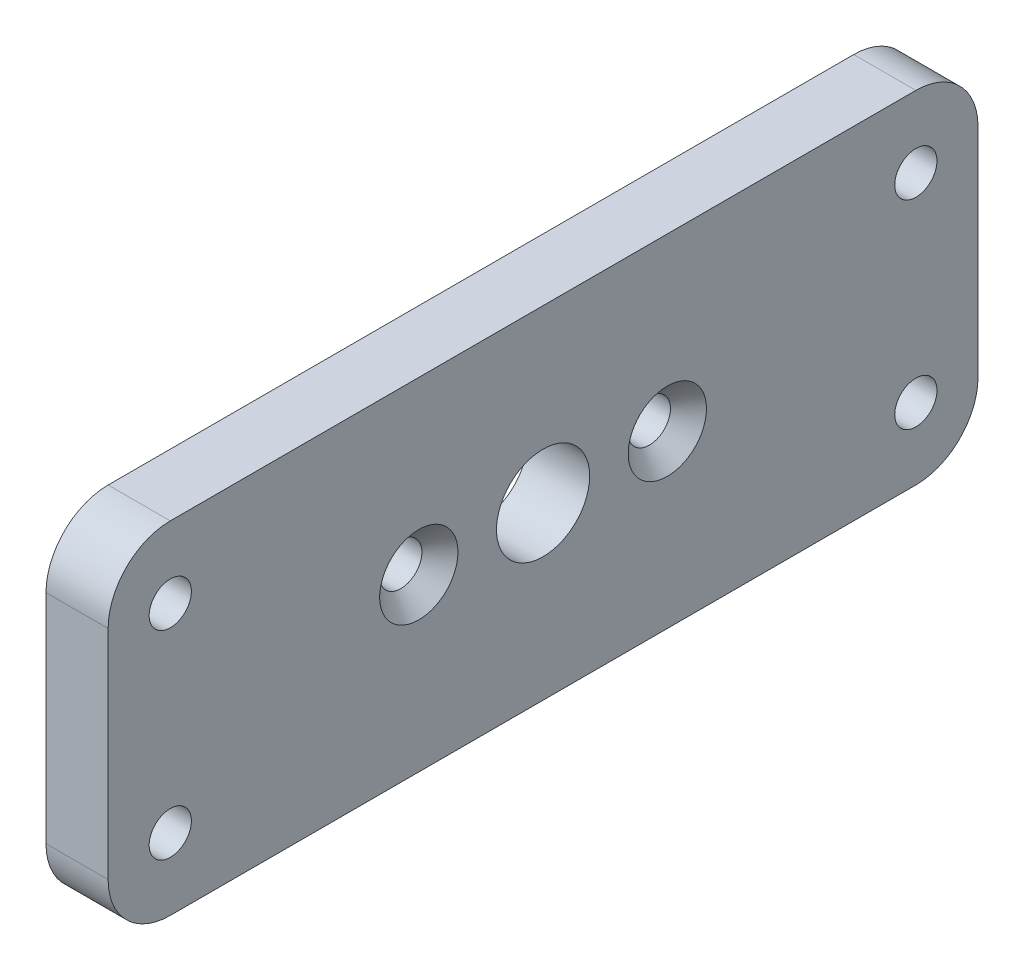
ISO-10303-21;
HEADER;
FILE_DESCRIPTION(('STEP AP214'),'2;1');
FILE_NAME('part.step','',(''),(''),'','','');
FILE_SCHEMA(('AUTOMOTIVE_DESIGN { 1 0 10303 214 1 1 1 1 }'));
ENDSEC;
DATA;
#1=APPLICATION_CONTEXT('core data for automotive mechanical design processes');
#2=APPLICATION_PROTOCOL_DEFINITION('international standard','automotive_design',2000,#1);
#3=PRODUCT_CONTEXT('',#1,'mechanical');
#4=PRODUCT('Part','Part','',(#3));
#5=PRODUCT_RELATED_PRODUCT_CATEGORY('part','',(#4));
#6=PRODUCT_DEFINITION_FORMATION('','',#4);
#7=PRODUCT_DEFINITION_CONTEXT('part definition',#1,'design');
#8=PRODUCT_DEFINITION('design','',#6,#7);
#9=PRODUCT_DEFINITION_SHAPE('','',#8);
#10=(LENGTH_UNIT() NAMED_UNIT(*) SI_UNIT(.MILLI.,.METRE.));
#11=(NAMED_UNIT(*) PLANE_ANGLE_UNIT() SI_UNIT($,.RADIAN.));
#12=(NAMED_UNIT(*) SI_UNIT($,.STERADIAN.) SOLID_ANGLE_UNIT());
#13=UNCERTAINTY_MEASURE_WITH_UNIT(LENGTH_MEASURE(1.E-05),#10,'distance_accuracy_value','');
#14=(GEOMETRIC_REPRESENTATION_CONTEXT(3) GLOBAL_UNCERTAINTY_ASSIGNED_CONTEXT((#13)) GLOBAL_UNIT_ASSIGNED_CONTEXT((#10,
#11,#12)) REPRESENTATION_CONTEXT('',''));
#15=CARTESIAN_POINT('',(0.,0.,0.));
#16=DIRECTION('',(0.,0.,1.));
#17=DIRECTION('',(1.,0.,0.));
#18=AXIS2_PLACEMENT_3D('',#15,#16,#17);
#19=CARTESIAN_POINT('',(5.,8.75,30.));
#20=DIRECTION('',(-1.,0.,0.));
#21=DIRECTION('',(0.,0.,1.));
#22=AXIS2_PLACEMENT_3D('',#19,#20,#21);
#23=PLANE('',#22);
#24=CARTESIAN_POINT('',(5.,8.,30.));
#25=DIRECTION('',(-1.,0.,0.));
#26=DIRECTION('',(0.,0.,1.));
#27=AXIS2_PLACEMENT_3D('',#24,#25,#26);
#28=CIRCLE('',#27,1.69999999999999);
#29=CARTESIAN_POINT('',(5.,8.,31.7));
#30=VERTEX_POINT('',#29);
#31=EDGE_CURVE('E223',#30,#30,#28,.T.);
#32=ORIENTED_EDGE('',*,*,#31,.T.);
#33=EDGE_LOOP('',(#32));
#34=FACE_BOUND('',#33,.T.);
#35=CARTESIAN_POINT('',(5.,-8.,30.));
#36=DIRECTION('',(-1.,0.,0.));
#37=DIRECTION('',(0.,0.,1.));
#38=AXIS2_PLACEMENT_3D('',#35,#36,#37);
#39=CIRCLE('',#38,1.69999999999999);
#40=CARTESIAN_POINT('',(5.,-8.,31.7));
#41=VERTEX_POINT('',#40);
#42=EDGE_CURVE('E217',#41,#41,#39,.T.);
#43=ORIENTED_EDGE('',*,*,#42,.T.);
#44=EDGE_LOOP('',(#43));
#45=FACE_BOUND('',#44,.T.);
#46=CARTESIAN_POINT('',(5.,-8.,-30.));
#47=DIRECTION('',(-1.,0.,0.));
#48=DIRECTION('',(0.,0.,1.));
#49=AXIS2_PLACEMENT_3D('',#46,#47,#48);
#50=CIRCLE('',#49,1.69999999999999);
#51=CARTESIAN_POINT('',(5.,-8.,-28.3));
#52=VERTEX_POINT('',#51);
#53=EDGE_CURVE('E211',#52,#52,#50,.T.);
#54=ORIENTED_EDGE('',*,*,#53,.T.);
#55=EDGE_LOOP('',(#54));
#56=FACE_BOUND('',#55,.T.);
#57=CARTESIAN_POINT('',(5.,8.,-30.));
#58=DIRECTION('',(-1.,0.,0.));
#59=DIRECTION('',(0.,0.,1.));
#60=AXIS2_PLACEMENT_3D('',#57,#58,#59);
#61=CIRCLE('',#60,1.69999999999999);
#62=CARTESIAN_POINT('',(5.,8.,-28.3));
#63=VERTEX_POINT('',#62);
#64=EDGE_CURVE('E205',#63,#63,#61,.T.);
#65=ORIENTED_EDGE('',*,*,#64,.T.);
#66=EDGE_LOOP('',(#65));
#67=FACE_BOUND('',#66,.T.);
#68=CARTESIAN_POINT('',(5.,0.,10.));
#69=DIRECTION('',(1.,0.,0.));
#70=DIRECTION('',(0.,0.,-1.));
#71=AXIS2_PLACEMENT_3D('',#68,#69,#70);
#72=CIRCLE('',#71,3.15);
#73=CARTESIAN_POINT('',(5.,0.,6.85));
#74=VERTEX_POINT('',#73);
#75=EDGE_CURVE('E202',#74,#74,#72,.T.);
#76=ORIENTED_EDGE('',*,*,#75,.F.);
#77=EDGE_LOOP('',(#76));
#78=FACE_BOUND('',#77,.T.);
#79=CARTESIAN_POINT('',(5.,0.,-10.));
#80=DIRECTION('',(1.,0.,0.));
#81=DIRECTION('',(0.,0.,-1.));
#82=AXIS2_PLACEMENT_3D('',#79,#80,#81);
#83=CIRCLE('',#82,3.15);
#84=CARTESIAN_POINT('',(5.,0.,-13.15));
#85=VERTEX_POINT('',#84);
#86=EDGE_CURVE('E193',#85,#85,#83,.T.);
#87=ORIENTED_EDGE('',*,*,#86,.F.);
#88=EDGE_LOOP('',(#87));
#89=FACE_BOUND('',#88,.T.);
#90=CARTESIAN_POINT('',(5.,8.75,30.));
#91=DIRECTION('',(1.,0.,0.));
#92=DIRECTION('',(0.,0.,1.));
#93=AXIS2_PLACEMENT_3D('',#90,#91,#92);
#94=CIRCLE('',#93,5.);
#95=CARTESIAN_POINT('',(5.,13.75,30.));
#96=VERTEX_POINT('',#95);
#97=CARTESIAN_POINT('',(5.,8.75,35.));
#98=VERTEX_POINT('',#97);
#99=EDGE_CURVE('E148',#96,#98,#94,.T.);
#100=ORIENTED_EDGE('',*,*,#99,.T.);
#101=DIRECTION('',(0.,-1.,0.));
#102=VECTOR('',#101,1.);
#103=CARTESIAN_POINT('',(5.,-8.75,35.));
#104=LINE('',#103,#102);
#105=CARTESIAN_POINT('',(5.,-8.75,35.));
#106=VERTEX_POINT('',#105);
#107=EDGE_CURVE('E96',#98,#106,#104,.T.);
#108=ORIENTED_EDGE('',*,*,#107,.T.);
#109=CARTESIAN_POINT('',(5.,-8.75,30.));
#110=DIRECTION('',(1.,0.,0.));
#111=DIRECTION('',(0.,0.,-1.));
#112=AXIS2_PLACEMENT_3D('',#109,#110,#111);
#113=CIRCLE('',#112,5.);
#114=CARTESIAN_POINT('',(5.,-13.75,30.));
#115=VERTEX_POINT('',#114);
#116=EDGE_CURVE('E163',#106,#115,#113,.T.);
#117=ORIENTED_EDGE('',*,*,#116,.T.);
#118=DIRECTION('',(0.,0.,-1.));
#119=VECTOR('',#118,1.);
#120=CARTESIAN_POINT('',(5.,-13.75,30.));
#121=LINE('',#120,#119);
#122=CARTESIAN_POINT('',(5.,-13.75,-30.));
#123=VERTEX_POINT('',#122);
#124=EDGE_CURVE('E176',#115,#123,#121,.T.);
#125=ORIENTED_EDGE('',*,*,#124,.T.);
#126=CARTESIAN_POINT('',(5.,-8.75,-30.));
#127=DIRECTION('',(1.,0.,0.));
#128=DIRECTION('',(0.,0.,-1.));
#129=AXIS2_PLACEMENT_3D('',#126,#127,#128);
#130=CIRCLE('',#129,5.);
#131=CARTESIAN_POINT('',(5.,-8.75,-35.));
#132=VERTEX_POINT('',#131);
#133=EDGE_CURVE('E115',#123,#132,#130,.T.);
#134=ORIENTED_EDGE('',*,*,#133,.T.);
#135=DIRECTION('',(0.,1.,0.));
#136=VECTOR('',#135,1.);
#137=CARTESIAN_POINT('',(5.,-8.75,-35.));
#138=LINE('',#137,#136);
#139=CARTESIAN_POINT('',(5.,8.75,-35.));
#140=VERTEX_POINT('',#139);
#141=EDGE_CURVE('E109',#132,#140,#138,.T.);
#142=ORIENTED_EDGE('',*,*,#141,.T.);
#143=CARTESIAN_POINT('',(5.,8.75,-30.));
#144=DIRECTION('',(1.,0.,0.));
#145=DIRECTION('',(0.,0.,-1.));
#146=AXIS2_PLACEMENT_3D('',#143,#144,#145);
#147=CIRCLE('',#146,5.);
#148=CARTESIAN_POINT('',(5.,13.75,-30.));
#149=VERTEX_POINT('',#148);
#150=EDGE_CURVE('E113',#140,#149,#147,.T.);
#151=ORIENTED_EDGE('',*,*,#150,.T.);
#152=DIRECTION('',(0.,0.,1.));
#153=VECTOR('',#152,1.);
#154=CARTESIAN_POINT('',(5.,13.75,30.));
#155=LINE('',#154,#153);
#156=EDGE_CURVE('E53',#149,#96,#155,.T.);
#157=ORIENTED_EDGE('',*,*,#156,.T.);
#158=EDGE_LOOP('',(#100,#108,#117,#125,#134,#142,#151,#157));
#159=FACE_BOUND('',#158,.T.);
#160=CARTESIAN_POINT('',(5.,0.,0.));
#161=DIRECTION('',(1.,0.,0.));
#162=DIRECTION('',(0.,0.,-1.));
#163=AXIS2_PLACEMENT_3D('',#160,#161,#162);
#164=CIRCLE('',#163,3.75);
#165=CARTESIAN_POINT('',(5.,0.,-3.75000000000001));
#166=VERTEX_POINT('',#165);
#167=EDGE_CURVE('E137',#166,#166,#164,.T.);
#168=ORIENTED_EDGE('',*,*,#167,.F.);
#169=EDGE_LOOP('',(#168));
#170=FACE_BOUND('',#169,.T.);
#171=ADVANCED_FACE('F36',(#34,#45,#56,#67,#78,#89,#159,#170),#23,.F.);
#172=CARTESIAN_POINT('',(0.,8.75,30.));
#173=DIRECTION('',(-1.,0.,0.));
#174=DIRECTION('',(0.,0.,1.));
#175=AXIS2_PLACEMENT_3D('',#172,#173,#174);
#176=PLANE('',#175);
#177=CARTESIAN_POINT('',(0.,8.,30.));
#178=DIRECTION('',(-1.,0.,0.));
#179=DIRECTION('',(0.,0.,1.));
#180=AXIS2_PLACEMENT_3D('',#177,#178,#179);
#181=CIRCLE('',#180,1.69999999999999);
#182=CARTESIAN_POINT('',(0.,8.,31.7));
#183=VERTEX_POINT('',#182);
#184=EDGE_CURVE('E226',#183,#183,#181,.T.);
#185=ORIENTED_EDGE('',*,*,#184,.F.);
#186=EDGE_LOOP('',(#185));
#187=FACE_BOUND('',#186,.T.);
#188=CARTESIAN_POINT('',(0.,-8.,30.));
#189=DIRECTION('',(-1.,0.,0.));
#190=DIRECTION('',(0.,0.,1.));
#191=AXIS2_PLACEMENT_3D('',#188,#189,#190);
#192=CIRCLE('',#191,1.69999999999999);
#193=CARTESIAN_POINT('',(0.,-8.,31.7));
#194=VERTEX_POINT('',#193);
#195=EDGE_CURVE('E220',#194,#194,#192,.T.);
#196=ORIENTED_EDGE('',*,*,#195,.F.);
#197=EDGE_LOOP('',(#196));
#198=FACE_BOUND('',#197,.T.);
#199=CARTESIAN_POINT('',(0.,-8.,-30.));
#200=DIRECTION('',(-1.,0.,0.));
#201=DIRECTION('',(0.,0.,1.));
#202=AXIS2_PLACEMENT_3D('',#199,#200,#201);
#203=CIRCLE('',#202,1.69999999999999);
#204=CARTESIAN_POINT('',(0.,-8.,-28.3));
#205=VERTEX_POINT('',#204);
#206=EDGE_CURVE('E214',#205,#205,#203,.T.);
#207=ORIENTED_EDGE('',*,*,#206,.F.);
#208=EDGE_LOOP('',(#207));
#209=FACE_BOUND('',#208,.T.);
#210=CARTESIAN_POINT('',(0.,8.,-30.));
#211=DIRECTION('',(-1.,0.,0.));
#212=DIRECTION('',(0.,0.,1.));
#213=AXIS2_PLACEMENT_3D('',#210,#211,#212);
#214=CIRCLE('',#213,1.69999999999999);
#215=CARTESIAN_POINT('',(0.,8.,-28.3));
#216=VERTEX_POINT('',#215);
#217=EDGE_CURVE('E208',#216,#216,#214,.T.);
#218=ORIENTED_EDGE('',*,*,#217,.F.);
#219=EDGE_LOOP('',(#218));
#220=FACE_BOUND('',#219,.T.);
#221=CARTESIAN_POINT('',(0.,0.,10.));
#222=DIRECTION('',(1.,0.,0.));
#223=DIRECTION('',(0.,0.,-1.));
#224=AXIS2_PLACEMENT_3D('',#221,#222,#223);
#225=CIRCLE('',#224,1.69999999999999);
#226=CARTESIAN_POINT('',(0.,0.,8.30000000000001));
#227=VERTEX_POINT('',#226);
#228=EDGE_CURVE('E196',#227,#227,#225,.T.);
#229=ORIENTED_EDGE('',*,*,#228,.T.);
#230=EDGE_LOOP('',(#229));
#231=FACE_BOUND('',#230,.T.);
#232=CARTESIAN_POINT('',(0.,0.,-10.));
#233=DIRECTION('',(1.,0.,0.));
#234=DIRECTION('',(0.,0.,-1.));
#235=AXIS2_PLACEMENT_3D('',#232,#233,#234);
#236=CIRCLE('',#235,1.69999999999999);
#237=CARTESIAN_POINT('',(0.,0.,-11.7));
#238=VERTEX_POINT('',#237);
#239=EDGE_CURVE('E185',#238,#238,#236,.T.);
#240=ORIENTED_EDGE('',*,*,#239,.T.);
#241=EDGE_LOOP('',(#240));
#242=FACE_BOUND('',#241,.T.);
#243=CARTESIAN_POINT('',(0.,8.75,30.));
#244=DIRECTION('',(1.,0.,0.));
#245=DIRECTION('',(0.,0.,1.));
#246=AXIS2_PLACEMENT_3D('',#243,#244,#245);
#247=CIRCLE('',#246,5.);
#248=CARTESIAN_POINT('',(0.,13.75,30.));
#249=VERTEX_POINT('',#248);
#250=CARTESIAN_POINT('',(0.,8.75,35.));
#251=VERTEX_POINT('',#250);
#252=EDGE_CURVE('E133',#249,#251,#247,.T.);
#253=ORIENTED_EDGE('',*,*,#252,.F.);
#254=DIRECTION('',(0.,0.,1.));
#255=VECTOR('',#254,1.);
#256=CARTESIAN_POINT('',(0.,13.75,30.));
#257=LINE('',#256,#255);
#258=CARTESIAN_POINT('',(0.,13.75,-30.));
#259=VERTEX_POINT('',#258);
#260=EDGE_CURVE('E88',#259,#249,#257,.T.);
#261=ORIENTED_EDGE('',*,*,#260,.F.);
#262=CARTESIAN_POINT('',(0.,8.75,-30.));
#263=DIRECTION('',(1.,0.,0.));
#264=DIRECTION('',(0.,0.,-1.));
#265=AXIS2_PLACEMENT_3D('',#262,#263,#264);
#266=CIRCLE('',#265,5.);
#267=CARTESIAN_POINT('',(0.,8.75,-35.));
#268=VERTEX_POINT('',#267);
#269=EDGE_CURVE('E82',#268,#259,#266,.T.);
#270=ORIENTED_EDGE('',*,*,#269,.F.);
#271=DIRECTION('',(0.,1.,0.));
#272=VECTOR('',#271,1.);
#273=CARTESIAN_POINT('',(0.,-8.75,-35.));
#274=LINE('',#273,#272);
#275=CARTESIAN_POINT('',(0.,-8.75,-35.));
#276=VERTEX_POINT('',#275);
#277=EDGE_CURVE('E123',#276,#268,#274,.T.);
#278=ORIENTED_EDGE('',*,*,#277,.F.);
#279=CARTESIAN_POINT('',(0.,-8.75,-30.));
#280=DIRECTION('',(1.,0.,0.));
#281=DIRECTION('',(0.,0.,-1.));
#282=AXIS2_PLACEMENT_3D('',#279,#280,#281);
#283=CIRCLE('',#282,5.);
#284=CARTESIAN_POINT('',(0.,-13.75,-30.));
#285=VERTEX_POINT('',#284);
#286=EDGE_CURVE('E143',#285,#276,#283,.T.);
#287=ORIENTED_EDGE('',*,*,#286,.F.);
#288=DIRECTION('',(0.,0.,-1.));
#289=VECTOR('',#288,1.);
#290=CARTESIAN_POINT('',(0.,-13.75,30.));
#291=LINE('',#290,#289);
#292=CARTESIAN_POINT('',(0.,-13.75,30.));
#293=VERTEX_POINT('',#292);
#294=EDGE_CURVE('E141',#293,#285,#291,.T.);
#295=ORIENTED_EDGE('',*,*,#294,.F.);
#296=CARTESIAN_POINT('',(0.,-8.75,30.));
#297=DIRECTION('',(1.,0.,0.));
#298=DIRECTION('',(0.,0.,-1.));
#299=AXIS2_PLACEMENT_3D('',#296,#297,#298);
#300=CIRCLE('',#299,5.);
#301=CARTESIAN_POINT('',(0.,-8.75,35.));
#302=VERTEX_POINT('',#301);
#303=EDGE_CURVE('E139',#302,#293,#300,.T.);
#304=ORIENTED_EDGE('',*,*,#303,.F.);
#305=DIRECTION('',(0.,-1.,0.));
#306=VECTOR('',#305,1.);
#307=CARTESIAN_POINT('',(0.,-8.75,35.));
#308=LINE('',#307,#306);
#309=EDGE_CURVE('E136',#251,#302,#308,.T.);
#310=ORIENTED_EDGE('',*,*,#309,.F.);
#311=EDGE_LOOP('',(#253,#261,#270,#278,#287,#295,#304,#310));
#312=FACE_BOUND('',#311,.T.);
#313=CARTESIAN_POINT('',(0.,0.,0.));
#314=DIRECTION('',(1.,0.,0.));
#315=DIRECTION('',(0.,0.,-1.));
#316=AXIS2_PLACEMENT_3D('',#313,#314,#315);
#317=CIRCLE('',#316,3.75);
#318=CARTESIAN_POINT('',(0.,0.,-3.75000000000001));
#319=VERTEX_POINT('',#318);
#320=EDGE_CURVE('E182',#319,#319,#317,.T.);
#321=ORIENTED_EDGE('',*,*,#320,.T.);
#322=EDGE_LOOP('',(#321));
#323=FACE_BOUND('',#322,.T.);
#324=ADVANCED_FACE('F167',(#187,#198,#209,#220,#231,#242,#312,#323),#176,.T.);
#325=CARTESIAN_POINT('',(5.,8.75,30.));
#326=DIRECTION('',(-1.,0.,0.));
#327=DIRECTION('',(0.,0.,1.));
#328=AXIS2_PLACEMENT_3D('',#325,#326,#327);
#329=CYLINDRICAL_SURFACE('',#328,5.);
#330=ORIENTED_EDGE('',*,*,#252,.T.);
#331=DIRECTION('',(-1.,0.,0.));
#332=VECTOR('',#331,1.);
#333=CARTESIAN_POINT('',(5.,8.75,35.));
#334=LINE('',#333,#332);
#335=EDGE_CURVE('E11',#98,#251,#334,.T.);
#336=ORIENTED_EDGE('',*,*,#335,.F.);
#337=ORIENTED_EDGE('',*,*,#99,.F.);
#338=DIRECTION('',(-1.,0.,0.));
#339=VECTOR('',#338,1.);
#340=CARTESIAN_POINT('',(5.,13.75,30.));
#341=LINE('',#340,#339);
#342=EDGE_CURVE('E129',#96,#249,#341,.T.);
#343=ORIENTED_EDGE('',*,*,#342,.T.);
#344=EDGE_LOOP('',(#330,#336,#337,#343));
#345=FACE_BOUND('',#344,.T.);
#346=ADVANCED_FACE('F38',(#345),#329,.T.);
#347=CARTESIAN_POINT('',(5.,-8.75,35.));
#348=DIRECTION('',(0.,0.,-1.));
#349=DIRECTION('',(-1.,0.,0.));
#350=AXIS2_PLACEMENT_3D('',#347,#348,#349);
#351=PLANE('',#350);
#352=ORIENTED_EDGE('',*,*,#309,.T.);
#353=DIRECTION('',(-1.,0.,0.));
#354=VECTOR('',#353,1.);
#355=CARTESIAN_POINT('',(5.,-8.75,35.));
#356=LINE('',#355,#354);
#357=EDGE_CURVE('E45',#106,#302,#356,.T.);
#358=ORIENTED_EDGE('',*,*,#357,.F.);
#359=ORIENTED_EDGE('',*,*,#107,.F.);
#360=ORIENTED_EDGE('',*,*,#335,.T.);
#361=EDGE_LOOP('',(#352,#358,#359,#360));
#362=FACE_BOUND('',#361,.T.);
#363=ADVANCED_FACE('F279',(#362),#351,.F.);
#364=CARTESIAN_POINT('',(5.,-8.75,30.));
#365=DIRECTION('',(-1.,0.,0.));
#366=DIRECTION('',(0.,0.,1.));
#367=AXIS2_PLACEMENT_3D('',#364,#365,#366);
#368=CYLINDRICAL_SURFACE('',#367,5.);
#369=ORIENTED_EDGE('',*,*,#303,.T.);
#370=DIRECTION('',(-1.,0.,0.));
#371=VECTOR('',#370,1.);
#372=CARTESIAN_POINT('',(5.,-13.75,30.));
#373=LINE('',#372,#371);
#374=EDGE_CURVE('E155',#115,#293,#373,.T.);
#375=ORIENTED_EDGE('',*,*,#374,.F.);
#376=ORIENTED_EDGE('',*,*,#116,.F.);
#377=ORIENTED_EDGE('',*,*,#357,.T.);
#378=EDGE_LOOP('',(#369,#375,#376,#377));
#379=FACE_BOUND('',#378,.T.);
#380=ADVANCED_FACE('F161',(#379),#368,.T.);
#381=CARTESIAN_POINT('',(5.,-13.75,30.));
#382=DIRECTION('',(0.,1.,0.));
#383=DIRECTION('',(0.,0.,1.));
#384=AXIS2_PLACEMENT_3D('',#381,#382,#383);
#385=PLANE('',#384);
#386=ORIENTED_EDGE('',*,*,#294,.T.);
#387=DIRECTION('',(-1.,0.,0.));
#388=VECTOR('',#387,1.);
#389=CARTESIAN_POINT('',(5.,-13.75,-30.));
#390=LINE('',#389,#388);
#391=EDGE_CURVE('E152',#123,#285,#390,.T.);
#392=ORIENTED_EDGE('',*,*,#391,.F.);
#393=ORIENTED_EDGE('',*,*,#124,.F.);
#394=ORIENTED_EDGE('',*,*,#374,.T.);
#395=EDGE_LOOP('',(#386,#392,#393,#394));
#396=FACE_BOUND('',#395,.T.);
#397=ADVANCED_FACE('F172',(#396),#385,.F.);
#398=CARTESIAN_POINT('',(5.,-8.75,-30.));
#399=DIRECTION('',(-1.,0.,0.));
#400=DIRECTION('',(0.,0.,1.));
#401=AXIS2_PLACEMENT_3D('',#398,#399,#400);
#402=CYLINDRICAL_SURFACE('',#401,5.);
#403=ORIENTED_EDGE('',*,*,#286,.T.);
#404=DIRECTION('',(-1.,0.,0.));
#405=VECTOR('',#404,1.);
#406=CARTESIAN_POINT('',(5.,-8.75,-35.));
#407=LINE('',#406,#405);
#408=EDGE_CURVE('E124',#132,#276,#407,.T.);
#409=ORIENTED_EDGE('',*,*,#408,.F.);
#410=ORIENTED_EDGE('',*,*,#133,.F.);
#411=ORIENTED_EDGE('',*,*,#391,.T.);
#412=EDGE_LOOP('',(#403,#409,#410,#411));
#413=FACE_BOUND('',#412,.T.);
#414=ADVANCED_FACE('F175',(#413),#402,.T.);
#415=CARTESIAN_POINT('',(5.,-8.75,-35.));
#416=DIRECTION('',(0.,0.,1.));
#417=DIRECTION('',(0.,-1.,0.));
#418=AXIS2_PLACEMENT_3D('',#415,#416,#417);
#419=PLANE('',#418);
#420=ORIENTED_EDGE('',*,*,#277,.T.);
#421=DIRECTION('',(-1.,0.,0.));
#422=VECTOR('',#421,1.);
#423=CARTESIAN_POINT('',(5.,8.75,-35.));
#424=LINE('',#423,#422);
#425=EDGE_CURVE('E120',#140,#268,#424,.T.);
#426=ORIENTED_EDGE('',*,*,#425,.F.);
#427=ORIENTED_EDGE('',*,*,#141,.F.);
#428=ORIENTED_EDGE('',*,*,#408,.T.);
#429=EDGE_LOOP('',(#420,#426,#427,#428));
#430=FACE_BOUND('',#429,.T.);
#431=ADVANCED_FACE('F121',(#430),#419,.F.);
#432=CARTESIAN_POINT('',(5.,8.75,-30.));
#433=DIRECTION('',(-1.,0.,0.));
#434=DIRECTION('',(0.,0.,1.));
#435=AXIS2_PLACEMENT_3D('',#432,#433,#434);
#436=CYLINDRICAL_SURFACE('',#435,5.);
#437=ORIENTED_EDGE('',*,*,#269,.T.);
#438=DIRECTION('',(-1.,0.,0.));
#439=VECTOR('',#438,1.);
#440=CARTESIAN_POINT('',(5.,13.75,-30.));
#441=LINE('',#440,#439);
#442=EDGE_CURVE('E125',#149,#259,#441,.T.);
#443=ORIENTED_EDGE('',*,*,#442,.F.);
#444=ORIENTED_EDGE('',*,*,#150,.F.);
#445=ORIENTED_EDGE('',*,*,#425,.T.);
#446=EDGE_LOOP('',(#437,#443,#444,#445));
#447=FACE_BOUND('',#446,.T.);
#448=ADVANCED_FACE('F127',(#447),#436,.T.);
#449=CARTESIAN_POINT('',(5.,13.75,30.));
#450=DIRECTION('',(0.,-1.,0.));
#451=DIRECTION('',(0.,0.,-1.));
#452=AXIS2_PLACEMENT_3D('',#449,#450,#451);
#453=PLANE('',#452);
#454=ORIENTED_EDGE('',*,*,#260,.T.);
#455=ORIENTED_EDGE('',*,*,#342,.F.);
#456=ORIENTED_EDGE('',*,*,#156,.F.);
#457=ORIENTED_EDGE('',*,*,#442,.T.);
#458=EDGE_LOOP('',(#454,#455,#456,#457));
#459=FACE_BOUND('',#458,.T.);
#460=ADVANCED_FACE('F267',(#459),#453,.F.);
#461=CARTESIAN_POINT('',(5.,0.,0.));
#462=DIRECTION('',(-1.,0.,0.));
#463=DIRECTION('',(0.,0.,1.));
#464=AXIS2_PLACEMENT_3D('',#461,#462,#463);
#465=CYLINDRICAL_SURFACE('',#464,3.75);
#466=ORIENTED_EDGE('',*,*,#167,.T.);
#467=EDGE_LOOP('',(#466));
#468=FACE_BOUND('',#467,.T.);
#469=ORIENTED_EDGE('',*,*,#320,.F.);
#470=EDGE_LOOP('',(#469));
#471=FACE_BOUND('',#470,.T.);
#472=ADVANCED_FACE('F249',(#468,#471),#465,.F.);
#473=CARTESIAN_POINT('',(5.,0.,-10.));
#474=DIRECTION('',(1.,0.,0.));
#475=DIRECTION('',(0.,0.,-1.));
#476=AXIS2_PLACEMENT_3D('',#473,#474,#475);
#477=CYLINDRICAL_SURFACE('',#476,1.69999999999999);
#478=ORIENTED_EDGE('',*,*,#239,.F.);
#479=EDGE_LOOP('',(#478));
#480=FACE_BOUND('',#479,.T.);
#481=CARTESIAN_POINT('',(3.55,0.,-10.));
#482=DIRECTION('',(1.,0.,0.));
#483=DIRECTION('',(0.,0.,-1.));
#484=AXIS2_PLACEMENT_3D('',#481,#482,#483);
#485=CIRCLE('',#484,1.7);
#486=CARTESIAN_POINT('',(3.55,0.,-11.7));
#487=VERTEX_POINT('',#486);
#488=EDGE_CURVE('E190',#487,#487,#485,.T.);
#489=ORIENTED_EDGE('',*,*,#488,.T.);
#490=EDGE_LOOP('',(#489));
#491=FACE_BOUND('',#490,.T.);
#492=ADVANCED_FACE('F245',(#480,#491),#477,.F.);
#493=CARTESIAN_POINT('',(5.,0.,-10.));
#494=DIRECTION('',(1.,0.,0.));
#495=DIRECTION('',(0.,0.,-1.));
#496=AXIS2_PLACEMENT_3D('',#493,#494,#495);
#497=CONICAL_SURFACE('',#496,3.15,0.785398163397449);
#498=ORIENTED_EDGE('',*,*,#488,.F.);
#499=EDGE_LOOP('',(#498));
#500=FACE_BOUND('',#499,.T.);
#501=ORIENTED_EDGE('',*,*,#86,.T.);
#502=EDGE_LOOP('',(#501));
#503=FACE_BOUND('',#502,.T.);
#504=ADVANCED_FACE('F248',(#500,#503),#497,.F.);
#505=CARTESIAN_POINT('',(5.,0.,10.));
#506=DIRECTION('',(1.,0.,0.));
#507=DIRECTION('',(0.,0.,-1.));
#508=AXIS2_PLACEMENT_3D('',#505,#506,#507);
#509=CYLINDRICAL_SURFACE('',#508,1.69999999999999);
#510=ORIENTED_EDGE('',*,*,#228,.F.);
#511=EDGE_LOOP('',(#510));
#512=FACE_BOUND('',#511,.T.);
#513=CARTESIAN_POINT('',(3.55,0.,10.));
#514=DIRECTION('',(1.,0.,0.));
#515=DIRECTION('',(0.,0.,-1.));
#516=AXIS2_PLACEMENT_3D('',#513,#514,#515);
#517=CIRCLE('',#516,1.7);
#518=CARTESIAN_POINT('',(3.55,0.,8.3));
#519=VERTEX_POINT('',#518);
#520=EDGE_CURVE('E199',#519,#519,#517,.T.);
#521=ORIENTED_EDGE('',*,*,#520,.T.);
#522=EDGE_LOOP('',(#521));
#523=FACE_BOUND('',#522,.T.);
#524=ADVANCED_FACE('F255',(#512,#523),#509,.F.);
#525=CARTESIAN_POINT('',(5.,0.,10.));
#526=DIRECTION('',(1.,0.,0.));
#527=DIRECTION('',(0.,0.,-1.));
#528=AXIS2_PLACEMENT_3D('',#525,#526,#527);
#529=CONICAL_SURFACE('',#528,3.15,0.785398163397449);
#530=ORIENTED_EDGE('',*,*,#520,.F.);
#531=EDGE_LOOP('',(#530));
#532=FACE_BOUND('',#531,.T.);
#533=ORIENTED_EDGE('',*,*,#75,.T.);
#534=EDGE_LOOP('',(#533));
#535=FACE_BOUND('',#534,.T.);
#536=ADVANCED_FACE('F307',(#532,#535),#529,.F.);
#537=CARTESIAN_POINT('',(0.,8.,-30.));
#538=DIRECTION('',(-1.,0.,0.));
#539=DIRECTION('',(0.,0.,1.));
#540=AXIS2_PLACEMENT_3D('',#537,#538,#539);
#541=CYLINDRICAL_SURFACE('',#540,1.69999999999999);
#542=ORIENTED_EDGE('',*,*,#64,.F.);
#543=EDGE_LOOP('',(#542));
#544=FACE_BOUND('',#543,.T.);
#545=ORIENTED_EDGE('',*,*,#217,.T.);
#546=EDGE_LOOP('',(#545));
#547=FACE_BOUND('',#546,.T.);
#548=ADVANCED_FACE('F301',(#544,#547),#541,.F.);
#549=CARTESIAN_POINT('',(0.,-8.,-30.));
#550=DIRECTION('',(-1.,0.,0.));
#551=DIRECTION('',(0.,0.,1.));
#552=AXIS2_PLACEMENT_3D('',#549,#550,#551);
#553=CYLINDRICAL_SURFACE('',#552,1.69999999999999);
#554=ORIENTED_EDGE('',*,*,#53,.F.);
#555=EDGE_LOOP('',(#554));
#556=FACE_BOUND('',#555,.T.);
#557=ORIENTED_EDGE('',*,*,#206,.T.);
#558=EDGE_LOOP('',(#557));
#559=FACE_BOUND('',#558,.T.);
#560=ADVANCED_FACE('F306',(#556,#559),#553,.F.);
#561=CARTESIAN_POINT('',(0.,-8.,30.));
#562=DIRECTION('',(-1.,0.,0.));
#563=DIRECTION('',(0.,0.,1.));
#564=AXIS2_PLACEMENT_3D('',#561,#562,#563);
#565=CYLINDRICAL_SURFACE('',#564,1.69999999999999);
#566=ORIENTED_EDGE('',*,*,#42,.F.);
#567=EDGE_LOOP('',(#566));
#568=FACE_BOUND('',#567,.T.);
#569=ORIENTED_EDGE('',*,*,#195,.T.);
#570=EDGE_LOOP('',(#569));
#571=FACE_BOUND('',#570,.T.);
#572=ADVANCED_FACE('F319',(#568,#571),#565,.F.);
#573=CARTESIAN_POINT('',(0.,8.,30.));
#574=DIRECTION('',(-1.,0.,0.));
#575=DIRECTION('',(0.,0.,1.));
#576=AXIS2_PLACEMENT_3D('',#573,#574,#575);
#577=CYLINDRICAL_SURFACE('',#576,1.69999999999999);
#578=ORIENTED_EDGE('',*,*,#31,.F.);
#579=EDGE_LOOP('',(#578));
#580=FACE_BOUND('',#579,.T.);
#581=ORIENTED_EDGE('',*,*,#184,.T.);
#582=EDGE_LOOP('',(#581));
#583=FACE_BOUND('',#582,.T.);
#584=ADVANCED_FACE('F230',(#580,#583),#577,.F.);
#585=CLOSED_SHELL('',(#171,#324,#346,#363,#380,#397,#414,#431,#448,#460,#472,#492,#504,#524,
#536,#548,#560,#572,#584));
#586=MANIFOLD_SOLID_BREP('B2',#585);
#587=ADVANCED_BREP_SHAPE_REPRESENTATION('',(#18,#586),#14);
#588=SHAPE_DEFINITION_REPRESENTATION(#9,#587);
ENDSEC;
END-ISO-10303-21;
